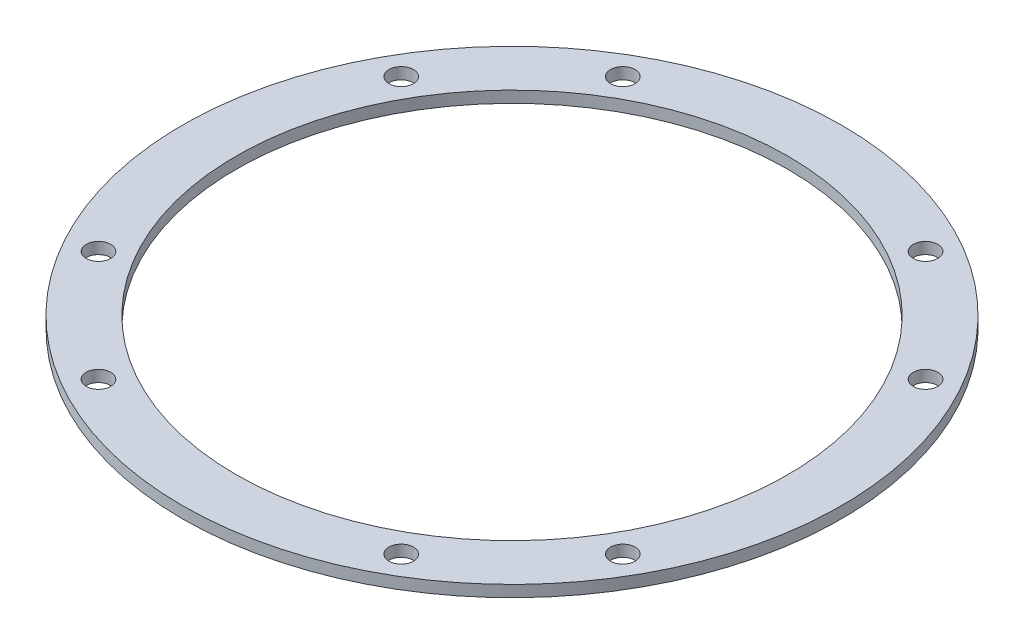
ISO-10303-21;
HEADER;
FILE_DESCRIPTION(('STEP AP214'),'2;1');
FILE_NAME('part.step','',(''),(''),'','','');
FILE_SCHEMA(('AUTOMOTIVE_DESIGN { 1 0 10303 214 1 1 1 1 }'));
ENDSEC;
DATA;
#1=APPLICATION_CONTEXT('core data for automotive mechanical design processes');
#2=APPLICATION_PROTOCOL_DEFINITION('international standard','automotive_design',2000,#1);
#3=PRODUCT_CONTEXT('',#1,'mechanical');
#4=PRODUCT('Part','Part','',(#3));
#5=PRODUCT_RELATED_PRODUCT_CATEGORY('part','',(#4));
#6=PRODUCT_DEFINITION_FORMATION('','',#4);
#7=PRODUCT_DEFINITION_CONTEXT('part definition',#1,'design');
#8=PRODUCT_DEFINITION('design','',#6,#7);
#9=PRODUCT_DEFINITION_SHAPE('','',#8);
#10=(LENGTH_UNIT() NAMED_UNIT(*) SI_UNIT(.MILLI.,.METRE.));
#11=(NAMED_UNIT(*) PLANE_ANGLE_UNIT() SI_UNIT($,.RADIAN.));
#12=(NAMED_UNIT(*) SI_UNIT($,.STERADIAN.) SOLID_ANGLE_UNIT());
#13=UNCERTAINTY_MEASURE_WITH_UNIT(LENGTH_MEASURE(1.E-05),#10,'distance_accuracy_value','');
#14=(GEOMETRIC_REPRESENTATION_CONTEXT(3) GLOBAL_UNCERTAINTY_ASSIGNED_CONTEXT((#13)) GLOBAL_UNIT_ASSIGNED_CONTEXT((#10,
#11,#12)) REPRESENTATION_CONTEXT('',''));
#15=CARTESIAN_POINT('',(0.,0.,0.));
#16=DIRECTION('',(0.,0.,1.));
#17=DIRECTION('',(1.,0.,0.));
#18=AXIS2_PLACEMENT_3D('',#15,#16,#17);
#19=CARTESIAN_POINT('',(0.,0.75,0.));
#20=DIRECTION('',(0.,1.,0.));
#21=DIRECTION('',(0.,0.,1.));
#22=AXIS2_PLACEMENT_3D('',#19,#20,#21);
#23=PLANE('',#22);
#24=CARTESIAN_POINT('',(-34.2080034494853,0.750000000000001,19.7500000000001));
#25=DIRECTION('',(0.,1.,0.));
#26=DIRECTION('',(0.,0.,1.));
#27=AXIS2_PLACEMENT_3D('',#24,#25,#26);
#28=CIRCLE('',#27,1.59999999999999);
#29=CARTESIAN_POINT('',(-34.2080034494853,0.750000000000001,21.35));
#30=VERTEX_POINT('',#29);
#31=EDGE_CURVE('E97',#30,#30,#28,.T.);
#32=ORIENTED_EDGE('',*,*,#31,.F.);
#33=EDGE_LOOP('',(#32));
#34=FACE_BOUND('',#33,.T.);
#35=CARTESIAN_POINT('',(-34.2080034494853,0.750000000000001,-19.75));
#36=DIRECTION('',(0.,1.,0.));
#37=DIRECTION('',(0.,0.,1.));
#38=AXIS2_PLACEMENT_3D('',#35,#36,#37);
#39=CIRCLE('',#38,1.59999999999999);
#40=CARTESIAN_POINT('',(-34.2080034494853,0.750000000000001,-18.15));
#41=VERTEX_POINT('',#40);
#42=EDGE_CURVE('E91',#41,#41,#39,.T.);
#43=ORIENTED_EDGE('',*,*,#42,.F.);
#44=EDGE_LOOP('',(#43));
#45=FACE_BOUND('',#44,.T.);
#46=CARTESIAN_POINT('',(-19.7500000000005,0.750000000000001,-34.2080034494868));
#47=DIRECTION('',(0.,1.,0.));
#48=DIRECTION('',(0.,0.,1.));
#49=AXIS2_PLACEMENT_3D('',#46,#47,#48);
#50=CIRCLE('',#49,1.59999999999999);
#51=CARTESIAN_POINT('',(-19.7500000000005,0.750000000000001,-32.6080034494868));
#52=VERTEX_POINT('',#51);
#53=EDGE_CURVE('E85',#52,#52,#50,.T.);
#54=ORIENTED_EDGE('',*,*,#53,.F.);
#55=EDGE_LOOP('',(#54));
#56=FACE_BOUND('',#55,.T.);
#57=CARTESIAN_POINT('',(19.7499999999996,0.750000000000001,-34.2080034494868));
#58=DIRECTION('',(0.,1.,0.));
#59=DIRECTION('',(0.,0.,1.));
#60=AXIS2_PLACEMENT_3D('',#57,#58,#59);
#61=CIRCLE('',#60,1.59999999999999);
#62=CARTESIAN_POINT('',(19.7499999999996,0.750000000000001,-32.6080034494868));
#63=VERTEX_POINT('',#62);
#64=EDGE_CURVE('E79',#63,#63,#61,.T.);
#65=ORIENTED_EDGE('',*,*,#64,.F.);
#66=EDGE_LOOP('',(#65));
#67=FACE_BOUND('',#66,.T.);
#68=CARTESIAN_POINT('',(34.2080034494864,0.750000000000001,-19.750000000002));
#69=DIRECTION('',(0.,1.,0.));
#70=DIRECTION('',(0.,0.,1.));
#71=AXIS2_PLACEMENT_3D('',#68,#69,#70);
#72=CIRCLE('',#71,1.59999999999999);
#73=CARTESIAN_POINT('',(34.2080034494864,0.750000000000001,-18.150000000002));
#74=VERTEX_POINT('',#73);
#75=EDGE_CURVE('E73',#74,#74,#72,.T.);
#76=ORIENTED_EDGE('',*,*,#75,.F.);
#77=EDGE_LOOP('',(#76));
#78=FACE_BOUND('',#77,.T.);
#79=CARTESIAN_POINT('',(34.2080034494864,0.750000000000001,19.7499999999981));
#80=DIRECTION('',(0.,1.,0.));
#81=DIRECTION('',(0.,0.,1.));
#82=AXIS2_PLACEMENT_3D('',#79,#80,#81);
#83=CIRCLE('',#82,1.59999999999998);
#84=CARTESIAN_POINT('',(34.2080034494864,0.750000000000001,21.3499999999981));
#85=VERTEX_POINT('',#84);
#86=EDGE_CURVE('E67',#85,#85,#83,.T.);
#87=ORIENTED_EDGE('',*,*,#86,.F.);
#88=EDGE_LOOP('',(#87));
#89=FACE_BOUND('',#88,.T.);
#90=CARTESIAN_POINT('',(19.7500000000016,0.750000000000001,34.2080034494849));
#91=DIRECTION('',(0.,1.,0.));
#92=DIRECTION('',(0.,0.,1.));
#93=AXIS2_PLACEMENT_3D('',#90,#91,#92);
#94=CIRCLE('',#93,1.59999999999999);
#95=CARTESIAN_POINT('',(19.7500000000016,0.750000000000001,35.8080034494849));
#96=VERTEX_POINT('',#95);
#97=EDGE_CURVE('E61',#96,#96,#94,.T.);
#98=ORIENTED_EDGE('',*,*,#97,.F.);
#99=EDGE_LOOP('',(#98));
#100=FACE_BOUND('',#99,.T.);
#101=CARTESIAN_POINT('',(-19.7499999999985,0.750000000000001,34.2080034494849));
#102=DIRECTION('',(0.,1.,0.));
#103=DIRECTION('',(0.,0.,1.));
#104=AXIS2_PLACEMENT_3D('',#101,#102,#103);
#105=CIRCLE('',#104,1.59999999999999);
#106=CARTESIAN_POINT('',(-19.7499999999985,0.750000000000001,35.8080034494849));
#107=VERTEX_POINT('',#106);
#108=EDGE_CURVE('E55',#107,#107,#105,.T.);
#109=ORIENTED_EDGE('',*,*,#108,.F.);
#110=EDGE_LOOP('',(#109));
#111=FACE_BOUND('',#110,.T.);
#112=CARTESIAN_POINT('',(0.,0.75,0.));
#113=DIRECTION('',(0.,1.,0.));
#114=DIRECTION('',(0.,0.,1.));
#115=AXIS2_PLACEMENT_3D('',#112,#113,#114);
#116=CIRCLE('',#115,43.);
#117=CARTESIAN_POINT('',(0.,0.75,43.));
#118=VERTEX_POINT('',#117);
#119=EDGE_CURVE('E10',#118,#118,#116,.T.);
#120=ORIENTED_EDGE('',*,*,#119,.T.);
#121=EDGE_LOOP('',(#120));
#122=FACE_BOUND('',#121,.T.);
#123=CARTESIAN_POINT('',(0.,0.75,0.));
#124=DIRECTION('',(0.,1.,0.));
#125=DIRECTION('',(0.,0.,1.));
#126=AXIS2_PLACEMENT_3D('',#123,#124,#125);
#127=CIRCLE('',#126,36.);
#128=CARTESIAN_POINT('',(0.,0.75,36.));
#129=VERTEX_POINT('',#128);
#130=EDGE_CURVE('E45',#129,#129,#127,.T.);
#131=ORIENTED_EDGE('',*,*,#130,.F.);
#132=EDGE_LOOP('',(#131));
#133=FACE_BOUND('',#132,.T.);
#134=ADVANCED_FACE('F34',(#34,#45,#56,#67,#78,#89,#100,#111,#122,#133),#23,.T.);
#135=CARTESIAN_POINT('',(0.,-0.75,0.));
#136=DIRECTION('',(0.,1.,0.));
#137=DIRECTION('',(0.,0.,1.));
#138=AXIS2_PLACEMENT_3D('',#135,#136,#137);
#139=PLANE('',#138);
#140=CARTESIAN_POINT('',(-34.2080034494853,-0.75,19.7500000000001));
#141=DIRECTION('',(0.,1.,0.));
#142=DIRECTION('',(0.,0.,1.));
#143=AXIS2_PLACEMENT_3D('',#140,#141,#142);
#144=CIRCLE('',#143,1.6);
#145=CARTESIAN_POINT('',(-34.2080034494853,-0.75,21.3500000000001));
#146=VERTEX_POINT('',#145);
#147=EDGE_CURVE('E94',#146,#146,#144,.T.);
#148=ORIENTED_EDGE('',*,*,#147,.T.);
#149=EDGE_LOOP('',(#148));
#150=FACE_BOUND('',#149,.T.);
#151=CARTESIAN_POINT('',(-34.2080034494853,-0.75,-19.75));
#152=DIRECTION('',(0.,1.,0.));
#153=DIRECTION('',(0.,0.,1.));
#154=AXIS2_PLACEMENT_3D('',#151,#152,#153);
#155=CIRCLE('',#154,1.6);
#156=CARTESIAN_POINT('',(-34.2080034494853,-0.75,-18.15));
#157=VERTEX_POINT('',#156);
#158=EDGE_CURVE('E88',#157,#157,#155,.T.);
#159=ORIENTED_EDGE('',*,*,#158,.T.);
#160=EDGE_LOOP('',(#159));
#161=FACE_BOUND('',#160,.T.);
#162=CARTESIAN_POINT('',(-19.7500000000005,-0.75,-34.2080034494868));
#163=DIRECTION('',(0.,1.,0.));
#164=DIRECTION('',(0.,0.,1.));
#165=AXIS2_PLACEMENT_3D('',#162,#163,#164);
#166=CIRCLE('',#165,1.6);
#167=CARTESIAN_POINT('',(-19.7500000000005,-0.75,-32.6080034494868));
#168=VERTEX_POINT('',#167);
#169=EDGE_CURVE('E82',#168,#168,#166,.T.);
#170=ORIENTED_EDGE('',*,*,#169,.T.);
#171=EDGE_LOOP('',(#170));
#172=FACE_BOUND('',#171,.T.);
#173=CARTESIAN_POINT('',(19.7499999999996,-0.75,-34.2080034494868));
#174=DIRECTION('',(0.,1.,0.));
#175=DIRECTION('',(0.,0.,1.));
#176=AXIS2_PLACEMENT_3D('',#173,#174,#175);
#177=CIRCLE('',#176,1.6);
#178=CARTESIAN_POINT('',(19.7499999999996,-0.75,-32.6080034494868));
#179=VERTEX_POINT('',#178);
#180=EDGE_CURVE('E76',#179,#179,#177,.T.);
#181=ORIENTED_EDGE('',*,*,#180,.T.);
#182=EDGE_LOOP('',(#181));
#183=FACE_BOUND('',#182,.T.);
#184=CARTESIAN_POINT('',(34.2080034494864,-0.75,-19.750000000002));
#185=DIRECTION('',(0.,1.,0.));
#186=DIRECTION('',(0.,0.,1.));
#187=AXIS2_PLACEMENT_3D('',#184,#185,#186);
#188=CIRCLE('',#187,1.6);
#189=CARTESIAN_POINT('',(34.2080034494864,-0.75,-18.150000000002));
#190=VERTEX_POINT('',#189);
#191=EDGE_CURVE('E70',#190,#190,#188,.T.);
#192=ORIENTED_EDGE('',*,*,#191,.T.);
#193=EDGE_LOOP('',(#192));
#194=FACE_BOUND('',#193,.T.);
#195=CARTESIAN_POINT('',(34.2080034494864,-0.75,19.7499999999981));
#196=DIRECTION('',(0.,1.,0.));
#197=DIRECTION('',(0.,0.,1.));
#198=AXIS2_PLACEMENT_3D('',#195,#196,#197);
#199=CIRCLE('',#198,1.6);
#200=CARTESIAN_POINT('',(34.2080034494864,-0.75,21.3499999999981));
#201=VERTEX_POINT('',#200);
#202=EDGE_CURVE('E64',#201,#201,#199,.T.);
#203=ORIENTED_EDGE('',*,*,#202,.T.);
#204=EDGE_LOOP('',(#203));
#205=FACE_BOUND('',#204,.T.);
#206=CARTESIAN_POINT('',(19.7500000000016,-0.75,34.2080034494849));
#207=DIRECTION('',(0.,1.,0.));
#208=DIRECTION('',(0.,0.,1.));
#209=AXIS2_PLACEMENT_3D('',#206,#207,#208);
#210=CIRCLE('',#209,1.6);
#211=CARTESIAN_POINT('',(19.7500000000016,-0.75,35.8080034494849));
#212=VERTEX_POINT('',#211);
#213=EDGE_CURVE('E58',#212,#212,#210,.T.);
#214=ORIENTED_EDGE('',*,*,#213,.T.);
#215=EDGE_LOOP('',(#214));
#216=FACE_BOUND('',#215,.T.);
#217=CARTESIAN_POINT('',(-19.7499999999985,-0.75,34.2080034494849));
#218=DIRECTION('',(0.,1.,0.));
#219=DIRECTION('',(0.,0.,1.));
#220=AXIS2_PLACEMENT_3D('',#217,#218,#219);
#221=CIRCLE('',#220,1.6);
#222=CARTESIAN_POINT('',(-19.7499999999985,-0.75,35.8080034494849));
#223=VERTEX_POINT('',#222);
#224=EDGE_CURVE('E50',#223,#223,#221,.T.);
#225=ORIENTED_EDGE('',*,*,#224,.T.);
#226=EDGE_LOOP('',(#225));
#227=FACE_BOUND('',#226,.T.);
#228=CARTESIAN_POINT('',(0.,-0.75,0.));
#229=DIRECTION('',(0.,1.,0.));
#230=DIRECTION('',(0.,0.,1.));
#231=AXIS2_PLACEMENT_3D('',#228,#229,#230);
#232=CIRCLE('',#231,43.);
#233=CARTESIAN_POINT('',(0.,-0.75,43.));
#234=VERTEX_POINT('',#233);
#235=EDGE_CURVE('E38',#234,#234,#232,.T.);
#236=ORIENTED_EDGE('',*,*,#235,.F.);
#237=EDGE_LOOP('',(#236));
#238=FACE_BOUND('',#237,.T.);
#239=CARTESIAN_POINT('',(0.,-0.75,0.));
#240=DIRECTION('',(0.,1.,0.));
#241=DIRECTION('',(0.,0.,1.));
#242=AXIS2_PLACEMENT_3D('',#239,#240,#241);
#243=CIRCLE('',#242,36.);
#244=CARTESIAN_POINT('',(0.,-0.75,36.));
#245=VERTEX_POINT('',#244);
#246=EDGE_CURVE('E47',#245,#245,#243,.T.);
#247=ORIENTED_EDGE('',*,*,#246,.T.);
#248=EDGE_LOOP('',(#247));
#249=FACE_BOUND('',#248,.T.);
#250=ADVANCED_FACE('F105',(#150,#161,#172,#183,#194,#205,#216,#227,#238,#249),#139,.F.);
#251=CARTESIAN_POINT('',(0.,0.75,0.));
#252=DIRECTION('',(0.,-1.,0.));
#253=DIRECTION('',(0.,0.,-1.));
#254=AXIS2_PLACEMENT_3D('',#251,#252,#253);
#255=CYLINDRICAL_SURFACE('',#254,43.);
#256=ORIENTED_EDGE('',*,*,#119,.F.);
#257=EDGE_LOOP('',(#256));
#258=FACE_BOUND('',#257,.T.);
#259=ORIENTED_EDGE('',*,*,#235,.T.);
#260=EDGE_LOOP('',(#259));
#261=FACE_BOUND('',#260,.T.);
#262=ADVANCED_FACE('F36',(#258,#261),#255,.T.);
#263=CARTESIAN_POINT('',(0.,0.75,0.));
#264=DIRECTION('',(0.,-1.,0.));
#265=DIRECTION('',(0.,0.,-1.));
#266=AXIS2_PLACEMENT_3D('',#263,#264,#265);
#267=CYLINDRICAL_SURFACE('',#266,36.);
#268=ORIENTED_EDGE('',*,*,#130,.T.);
#269=EDGE_LOOP('',(#268));
#270=FACE_BOUND('',#269,.T.);
#271=ORIENTED_EDGE('',*,*,#246,.F.);
#272=EDGE_LOOP('',(#271));
#273=FACE_BOUND('',#272,.T.);
#274=ADVANCED_FACE('F123',(#270,#273),#267,.F.);
#275=CARTESIAN_POINT('',(-19.7499999999985,0.75,34.2080034494849));
#276=DIRECTION('',(0.,1.,0.));
#277=DIRECTION('',(0.,0.,1.));
#278=AXIS2_PLACEMENT_3D('',#275,#276,#277);
#279=CYLINDRICAL_SURFACE('',#278,1.59999999999999);
#280=ORIENTED_EDGE('',*,*,#224,.F.);
#281=EDGE_LOOP('',(#280));
#282=FACE_BOUND('',#281,.T.);
#283=ORIENTED_EDGE('',*,*,#108,.T.);
#284=EDGE_LOOP('',(#283));
#285=FACE_BOUND('',#284,.T.);
#286=ADVANCED_FACE('F126',(#282,#285),#279,.F.);
#287=CARTESIAN_POINT('',(19.7500000000016,0.75,34.2080034494849));
#288=DIRECTION('',(0.,1.,0.));
#289=DIRECTION('',(0.,0.,1.));
#290=AXIS2_PLACEMENT_3D('',#287,#288,#289);
#291=CYLINDRICAL_SURFACE('',#290,1.59999999999999);
#292=ORIENTED_EDGE('',*,*,#213,.F.);
#293=EDGE_LOOP('',(#292));
#294=FACE_BOUND('',#293,.T.);
#295=ORIENTED_EDGE('',*,*,#97,.T.);
#296=EDGE_LOOP('',(#295));
#297=FACE_BOUND('',#296,.T.);
#298=ADVANCED_FACE('F140',(#294,#297),#291,.F.);
#299=CARTESIAN_POINT('',(34.2080034494864,0.75,19.7499999999981));
#300=DIRECTION('',(0.,1.,0.));
#301=DIRECTION('',(0.,0.,1.));
#302=AXIS2_PLACEMENT_3D('',#299,#300,#301);
#303=CYLINDRICAL_SURFACE('',#302,1.59999999999999);
#304=ORIENTED_EDGE('',*,*,#202,.F.);
#305=EDGE_LOOP('',(#304));
#306=FACE_BOUND('',#305,.T.);
#307=ORIENTED_EDGE('',*,*,#86,.T.);
#308=EDGE_LOOP('',(#307));
#309=FACE_BOUND('',#308,.T.);
#310=ADVANCED_FACE('F144',(#306,#309),#303,.F.);
#311=CARTESIAN_POINT('',(34.2080034494864,0.75,-19.750000000002));
#312=DIRECTION('',(0.,1.,0.));
#313=DIRECTION('',(0.,0.,1.));
#314=AXIS2_PLACEMENT_3D('',#311,#312,#313);
#315=CYLINDRICAL_SURFACE('',#314,1.59999999999999);
#316=ORIENTED_EDGE('',*,*,#191,.F.);
#317=EDGE_LOOP('',(#316));
#318=FACE_BOUND('',#317,.T.);
#319=ORIENTED_EDGE('',*,*,#75,.T.);
#320=EDGE_LOOP('',(#319));
#321=FACE_BOUND('',#320,.T.);
#322=ADVANCED_FACE('F148',(#318,#321),#315,.F.);
#323=CARTESIAN_POINT('',(19.7499999999996,0.75,-34.2080034494868));
#324=DIRECTION('',(0.,1.,0.));
#325=DIRECTION('',(0.,0.,1.));
#326=AXIS2_PLACEMENT_3D('',#323,#324,#325);
#327=CYLINDRICAL_SURFACE('',#326,1.59999999999999);
#328=ORIENTED_EDGE('',*,*,#180,.F.);
#329=EDGE_LOOP('',(#328));
#330=FACE_BOUND('',#329,.T.);
#331=ORIENTED_EDGE('',*,*,#64,.T.);
#332=EDGE_LOOP('',(#331));
#333=FACE_BOUND('',#332,.T.);
#334=ADVANCED_FACE('F152',(#330,#333),#327,.F.);
#335=CARTESIAN_POINT('',(-19.7500000000005,0.75,-34.2080034494868));
#336=DIRECTION('',(0.,1.,0.));
#337=DIRECTION('',(0.,0.,1.));
#338=AXIS2_PLACEMENT_3D('',#335,#336,#337);
#339=CYLINDRICAL_SURFACE('',#338,1.59999999999999);
#340=ORIENTED_EDGE('',*,*,#169,.F.);
#341=EDGE_LOOP('',(#340));
#342=FACE_BOUND('',#341,.T.);
#343=ORIENTED_EDGE('',*,*,#53,.T.);
#344=EDGE_LOOP('',(#343));
#345=FACE_BOUND('',#344,.T.);
#346=ADVANCED_FACE('F156',(#342,#345),#339,.F.);
#347=CARTESIAN_POINT('',(-34.2080034494853,0.75,-19.75));
#348=DIRECTION('',(0.,1.,0.));
#349=DIRECTION('',(0.,0.,1.));
#350=AXIS2_PLACEMENT_3D('',#347,#348,#349);
#351=CYLINDRICAL_SURFACE('',#350,1.59999999999999);
#352=ORIENTED_EDGE('',*,*,#158,.F.);
#353=EDGE_LOOP('',(#352));
#354=FACE_BOUND('',#353,.T.);
#355=ORIENTED_EDGE('',*,*,#42,.T.);
#356=EDGE_LOOP('',(#355));
#357=FACE_BOUND('',#356,.T.);
#358=ADVANCED_FACE('F160',(#354,#357),#351,.F.);
#359=CARTESIAN_POINT('',(-34.2080034494853,0.75,19.7500000000001));
#360=DIRECTION('',(0.,1.,0.));
#361=DIRECTION('',(0.,0.,1.));
#362=AXIS2_PLACEMENT_3D('',#359,#360,#361);
#363=CYLINDRICAL_SURFACE('',#362,1.59999999999999);
#364=ORIENTED_EDGE('',*,*,#147,.F.);
#365=EDGE_LOOP('',(#364));
#366=FACE_BOUND('',#365,.T.);
#367=ORIENTED_EDGE('',*,*,#31,.T.);
#368=EDGE_LOOP('',(#367));
#369=FACE_BOUND('',#368,.T.);
#370=ADVANCED_FACE('F101',(#366,#369),#363,.F.);
#371=CLOSED_SHELL('',(#134,#250,#262,#274,#286,#298,#310,#322,#334,#346,#358,#370));
#372=MANIFOLD_SOLID_BREP('B2',#371);
#373=ADVANCED_BREP_SHAPE_REPRESENTATION('',(#18,#372),#14);
#374=SHAPE_DEFINITION_REPRESENTATION(#9,#373);
ENDSEC;
END-ISO-10303-21;
